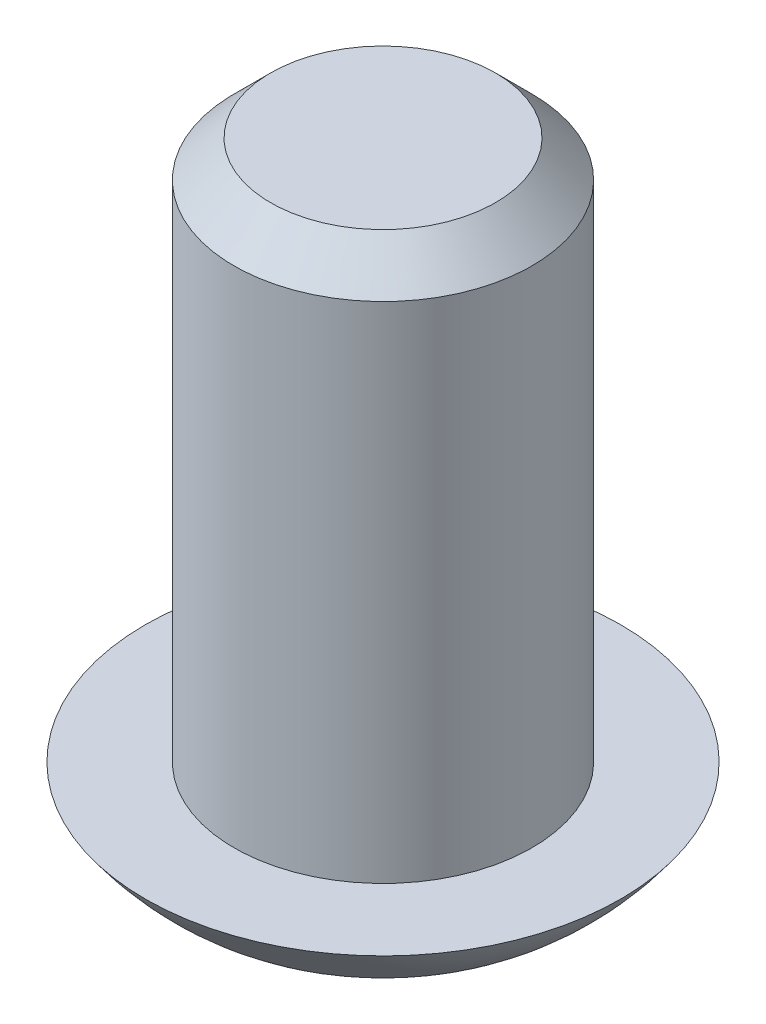
ISO-10303-21;
HEADER;
FILE_DESCRIPTION(('STEP AP214'),'2;1');
FILE_NAME('part.step','',(''),(''),'','','');
FILE_SCHEMA(('AUTOMOTIVE_DESIGN { 1 0 10303 214 1 1 1 1 }'));
ENDSEC;
DATA;
#1=APPLICATION_CONTEXT('core data for automotive mechanical design processes');
#2=APPLICATION_PROTOCOL_DEFINITION('international standard','automotive_design',2000,#1);
#3=PRODUCT_CONTEXT('',#1,'mechanical');
#4=PRODUCT('Part','Part','',(#3));
#5=PRODUCT_RELATED_PRODUCT_CATEGORY('part','',(#4));
#6=PRODUCT_DEFINITION_FORMATION('','',#4);
#7=PRODUCT_DEFINITION_CONTEXT('part definition',#1,'design');
#8=PRODUCT_DEFINITION('design','',#6,#7);
#9=PRODUCT_DEFINITION_SHAPE('','',#8);
#10=(LENGTH_UNIT() NAMED_UNIT(*) SI_UNIT(.MILLI.,.METRE.));
#11=(NAMED_UNIT(*) PLANE_ANGLE_UNIT() SI_UNIT($,.RADIAN.));
#12=(NAMED_UNIT(*) SI_UNIT($,.STERADIAN.) SOLID_ANGLE_UNIT());
#13=UNCERTAINTY_MEASURE_WITH_UNIT(LENGTH_MEASURE(1.E-05),#10,'distance_accuracy_value','');
#14=(GEOMETRIC_REPRESENTATION_CONTEXT(3) GLOBAL_UNCERTAINTY_ASSIGNED_CONTEXT((#13)) GLOBAL_UNIT_ASSIGNED_CONTEXT((#10,
#11,#12)) REPRESENTATION_CONTEXT('',''));
#15=CARTESIAN_POINT('',(0.,0.,0.));
#16=DIRECTION('',(0.,0.,1.));
#17=DIRECTION('',(1.,0.,0.));
#18=AXIS2_PLACEMENT_3D('',#15,#16,#17);
#19=CARTESIAN_POINT('',(0.,2.54,0.));
#20=DIRECTION('',(0.,-1.,0.));
#21=DIRECTION('',(0.,0.,-1.));
#22=AXIS2_PLACEMENT_3D('',#19,#20,#21);
#23=CYLINDRICAL_SURFACE('',#22,0.7);
#24=CARTESIAN_POINT('',(0.,0.,0.));
#25=DIRECTION('',(0.,-1.,0.));
#26=DIRECTION('',(0.,0.,-1.));
#27=AXIS2_PLACEMENT_3D('',#24,#25,#26);
#28=CIRCLE('',#27,0.699999999999999);
#29=CARTESIAN_POINT('',(0.,0.,-0.699999999999999));
#30=VERTEX_POINT('',#29);
#31=EDGE_CURVE('E258',#30,#30,#28,.T.);
#32=ORIENTED_EDGE('',*,*,#31,.F.);
#33=EDGE_LOOP('',(#32));
#34=FACE_BOUND('',#33,.T.);
#35=CARTESIAN_POINT('',(0.,2.36850000000001,0.));
#36=DIRECTION('',(0.,-1.,0.));
#37=DIRECTION('',(0.,0.,-1.));
#38=AXIS2_PLACEMENT_3D('',#35,#36,#37);
#39=CIRCLE('',#38,0.7);
#40=CARTESIAN_POINT('',(0.,2.36850000000001,-0.7));
#41=VERTEX_POINT('',#40);
#42=EDGE_CURVE('E140',#41,#41,#39,.T.);
#43=ORIENTED_EDGE('',*,*,#42,.T.);
#44=EDGE_LOOP('',(#43));
#45=FACE_BOUND('',#44,.T.);
#46=ADVANCED_FACE('F47',(#34,#45),#23,.T.);
#47=CARTESIAN_POINT('',(0.,2.54,0.));
#48=DIRECTION('',(0.,-1.,0.));
#49=DIRECTION('',(0.,0.,-1.));
#50=AXIS2_PLACEMENT_3D('',#47,#48,#49);
#51=CONICAL_SURFACE('',#50,0.528500000000001,0.785398163397461);
#52=ORIENTED_EDGE('',*,*,#42,.F.);
#53=EDGE_LOOP('',(#52));
#54=FACE_BOUND('',#53,.T.);
#55=CARTESIAN_POINT('',(0.,2.54,0.));
#56=DIRECTION('',(0.,-1.,0.));
#57=DIRECTION('',(0.,0.,-1.));
#58=AXIS2_PLACEMENT_3D('',#55,#56,#57);
#59=CIRCLE('',#58,0.528500000000001);
#60=CARTESIAN_POINT('',(0.,2.54,-0.528500000000001));
#61=VERTEX_POINT('',#60);
#62=EDGE_CURVE('E261',#61,#61,#59,.T.);
#63=ORIENTED_EDGE('',*,*,#62,.T.);
#64=EDGE_LOOP('',(#63));
#65=FACE_BOUND('',#64,.T.);
#66=ADVANCED_FACE('F161',(#54,#65),#51,.T.);
#67=CARTESIAN_POINT('',(0.,2.54,0.));
#68=DIRECTION('',(0.,1.,0.));
#69=DIRECTION('',(0.,0.,1.));
#70=AXIS2_PLACEMENT_3D('',#67,#68,#69);
#71=PLANE('',#70);
#72=ORIENTED_EDGE('',*,*,#62,.F.);
#73=EDGE_LOOP('',(#72));
#74=FACE_BOUND('',#73,.T.);
#75=ADVANCED_FACE('F49',(#74),#71,.T.);
#76=CARTESIAN_POINT('',(1.11694871713695,0.,0.));
#77=CARTESIAN_POINT('',(0.722805152040096,-0.559065825798239,0.));
#78=CARTESIAN_POINT('',(0.,-0.478908215937554,0.));
#79=B_SPLINE_CURVE_WITH_KNOTS('',2,(#76,#77,#78),.UNSPECIFIED.,.F.,.F.,(3,3),(0.,1.),.UNSPECIFIED.);
#80=CARTESIAN_POINT('',(0.,0.,0.));
#81=DIRECTION('',(0.,1.,0.));
#82=AXIS1_PLACEMENT('',#80,#81);
#83=SURFACE_OF_REVOLUTION('',#79,#82);
#84=CARTESIAN_POINT('',(-0.899315648743908,-0.238000032,-0.058524320668122));
#85=CARTESIAN_POINT('',(-0.870908297649099,-0.261900915256852,-0.0585243206681219));
#86=CARTESIAN_POINT('',(-0.841263504507934,-0.284330744241003,-0.0585243206681219));
#87=CARTESIAN_POINT('',(-0.779868665745607,-0.325856790653514,-0.058524320668122));
#88=CARTESIAN_POINT('',(-0.748125839960084,-0.344963695028522,-0.058524320668122));
#89=CARTESIAN_POINT('',(-0.663683025897662,-0.389694797470847,-0.0585243206681222));
#90=CARTESIAN_POINT('',(-0.609536626906563,-0.412641469070939,-0.0585243206681223));
#91=CARTESIAN_POINT('',(-0.498010574017839,-0.449312698549096,-0.0585243206681216));
#92=CARTESIAN_POINT('',(-0.440618720207825,-0.462999552814263,-0.0585243206681209));
#93=CARTESIAN_POINT('',(-0.355511650964227,-0.476778019573035,-0.0585243206681214));
#94=CARTESIAN_POINT('',(-0.328284207991363,-0.480227578762016,-0.0585243206681218));
#95=CARTESIAN_POINT('',(-0.273652683010128,-0.485402117770418,-0.0585243206681221));
#96=CARTESIAN_POINT('',(-0.246248543258705,-0.487126501725287,-0.058524320668122));
#97=CARTESIAN_POINT('',(-0.1915785286076,-0.489007186815417,-0.0585243206681219));
#98=CARTESIAN_POINT('',(-0.164312983513688,-0.489174089859625,-0.0585243206681219));
#99=CARTESIAN_POINT('',(-0.123450917767678,-0.488478308575888,-0.058524320668122));
#100=CARTESIAN_POINT('',(-0.109843161677998,-0.488089128882075,-0.058524320668122));
#101=CARTESIAN_POINT('',(-0.0826373710026249,-0.487119521610592,-0.058524320668122));
#102=CARTESIAN_POINT('',(-0.0690393348854089,-0.486539138909099,-0.058524320668122));
#103=CARTESIAN_POINT('',(-0.0554440932645397,-0.485924805268687,-0.058524320668122));
#104=B_SPLINE_CURVE_WITH_KNOTS('',3,(#84,#85,#86,#87,#88,#89,#90,#91,#92,#93,#94,#95,#96,#97,
#98,#99,#100,#101,#102,#103),.UNSPECIFIED.,.F.,.F.,(4,2,2,2,2,2,2,2,2,4),(0.,0.111317463769919,
0.222270015519336,0.397787243667058,0.574014899984797,0.656307474395722,0.738628462335729,
0.820388671926627,0.861227383915214,0.90205651770105),.UNSPECIFIED.);
#105=CARTESIAN_POINT('',(-0.899315648743908,-0.238000032,-0.058524320668122));
#106=VERTEX_POINT('',#105);
#107=CARTESIAN_POINT('',(-0.0554440932645484,-0.485924805268688,-0.058524320668122));
#108=VERTEX_POINT('',#107);
#109=EDGE_CURVE('E11',#106,#108,#104,.T.);
#110=ORIENTED_EDGE('',*,*,#109,.F.);
#111=CARTESIAN_POINT('',(0.,-0.238000032,0.));
#112=DIRECTION('',(0.,1.,0.));
#113=DIRECTION('',(-1.,0.,0.));
#114=AXIS2_PLACEMENT_3D('',#111,#112,#113);
#115=CIRCLE('',#114,0.901217916036594);
#116=CARTESIAN_POINT('',(-0.899315648743908,-0.238000032,0.0585243206681215));
#117=VERTEX_POINT('',#116);
#118=EDGE_CURVE('E215',#117,#106,#115,.F.);
#119=ORIENTED_EDGE('',*,*,#118,.F.);
#120=CARTESIAN_POINT('',(-0.899315648743908,-0.238000032,0.0585243206681214));
#121=CARTESIAN_POINT('',(-0.870908297649099,-0.261900915256853,0.0585243206681215));
#122=CARTESIAN_POINT('',(-0.841263504507934,-0.284330744241003,0.0585243206681215));
#123=CARTESIAN_POINT('',(-0.779868665745607,-0.325856790653515,0.0585243206681215));
#124=CARTESIAN_POINT('',(-0.748125839960084,-0.344963695028522,0.0585243206681216));
#125=CARTESIAN_POINT('',(-0.663683025897662,-0.389694797470847,0.0585243206681217));
#126=CARTESIAN_POINT('',(-0.609536626906563,-0.412641469070939,0.0585243206681218));
#127=CARTESIAN_POINT('',(-0.498010574017839,-0.449312698549096,0.0585243206681212));
#128=CARTESIAN_POINT('',(-0.440618720207825,-0.462999552814263,0.0585243206681204));
#129=CARTESIAN_POINT('',(-0.355511650964228,-0.476778019573035,0.058524320668121));
#130=CARTESIAN_POINT('',(-0.328284207991364,-0.480227578762016,0.0585243206681214));
#131=CARTESIAN_POINT('',(-0.273652683010131,-0.485402117770418,0.0585243206681217));
#132=CARTESIAN_POINT('',(-0.246248543258708,-0.487126501725287,0.0585243206681216));
#133=CARTESIAN_POINT('',(-0.191578528607605,-0.489007186815417,0.0585243206681215));
#134=CARTESIAN_POINT('',(-0.164312983513693,-0.489174089859625,0.0585243206681215));
#135=CARTESIAN_POINT('',(-0.123450917767684,-0.488478308575888,0.0585243206681215));
#136=CARTESIAN_POINT('',(-0.109843161678005,-0.488089128882075,0.0585243206681215));
#137=CARTESIAN_POINT('',(-0.0826373710026326,-0.487119521610592,0.0585243206681215));
#138=CARTESIAN_POINT('',(-0.069039334885417,-0.486539138909099,0.0585243206681215));
#139=CARTESIAN_POINT('',(-0.055444093264548,-0.485924805268687,0.0585243206681215));
#140=B_SPLINE_CURVE_WITH_KNOTS('',3,(#120,#121,#122,#123,#124,#125,#126,#127,#128,#129,#130,
#131,#132,#133,#134,#135,#136,#137,#138,#139),.UNSPECIFIED.,.F.,.F.,(4,2,2,2,2,2,2,2,2,4),(0.,
0.11131746376992,0.222270015519336,0.397787243667058,0.574014899984797,0.65630747439572,
0.738628462335725,0.82038867192662,0.861227383915207,0.902056517701042),.UNSPECIFIED.);
#141=CARTESIAN_POINT('',(-0.0554440932645484,-0.485924805268687,0.0585243206681215));
#142=VERTEX_POINT('',#141);
#143=EDGE_CURVE('E132',#117,#142,#140,.T.);
#144=ORIENTED_EDGE('',*,*,#143,.T.);
#145=CARTESIAN_POINT('',(-0.0554440932645485,-0.238000032,0.899510802996503));
#146=CARTESIAN_POINT('',(-0.0554440932645485,-0.261902810827655,0.871107346976378));
#147=CARTESIAN_POINT('',(-0.0554440932645484,-0.284334905605569,0.841466424604842));
#148=CARTESIAN_POINT('',(-0.0554440932645484,-0.32586788481248,0.780076237972695));
#149=CARTESIAN_POINT('',(-0.0554440932645484,-0.344979151549301,0.748333989435702));
#150=CARTESIAN_POINT('',(-0.0554440932645485,-0.389714635457796,0.663903536446075));
#151=CARTESIAN_POINT('',(-0.0554440932645486,-0.412662988634491,0.609769485309013));
#152=CARTESIAN_POINT('',(-0.0554440932645482,-0.449337139106365,0.49827165677898));
#153=CARTESIAN_POINT('',(-0.0554440932645477,-0.463026007849966,0.440895924473377));
#154=CARTESIAN_POINT('',(-0.055444093264548,-0.47676855613836,0.356036927922827));
#155=CARTESIAN_POINT('',(-0.0554440932645483,-0.480196985496946,0.329043854754958));
#156=CARTESIAN_POINT('',(-0.0554440932645485,-0.485354250683286,0.274883463225116));
#157=CARTESIAN_POINT('',(-0.0554440932645484,-0.48708255301048,0.24771609285869));
#158=CARTESIAN_POINT('',(-0.0554440932645484,-0.488988215510948,0.193513238710436));
#159=CARTESIAN_POINT('',(-0.0554440932645484,-0.489175844473608,0.166478084026633));
#160=CARTESIAN_POINT('',(-0.0554440932645484,-0.488505526627026,0.125959953640712));
#161=CARTESIAN_POINT('',(-0.0554440932645484,-0.488123865475893,0.112466048739799));
#162=CARTESIAN_POINT('',(-0.0554440932645484,-0.487152850011281,0.0854883490188783));
#163=CARTESIAN_POINT('',(-0.0554440932645484,-0.486563540521024,0.0720045526458262));
#164=CARTESIAN_POINT('',(-0.0554440932645484,-0.485924805268687,0.0585243206681217));
#165=B_SPLINE_CURVE_WITH_KNOTS('',3,(#145,#146,#147,#148,#149,#150,#151,#152,#153,#154,#155,
#156,#157,#158,#159,#160,#161,#162,#163,#164),.UNSPECIFIED.,.F.,.F.,(4,2,2,2,2,2,2,2,2,4),(0.,
0.111312285149621,0.222270042099696,0.397755510075376,0.573936784299827,0.655525020341214,
0.737138850645145,0.818208268867295,0.85870470340935,0.899192401692169),.UNSPECIFIED.);
#166=CARTESIAN_POINT('',(-0.0554440932645484,-0.238000032,0.899510802996503));
#167=VERTEX_POINT('',#166);
#168=EDGE_CURVE('E76',#167,#142,#165,.T.);
#169=ORIENTED_EDGE('',*,*,#168,.F.);
#170=CARTESIAN_POINT('',(0.0554440932645484,-0.238000032,0.899510802996503));
#171=VERTEX_POINT('',#170);
#172=EDGE_CURVE('E125',#171,#167,#115,.F.);
#173=ORIENTED_EDGE('',*,*,#172,.F.);
#174=CARTESIAN_POINT('',(0.0554440932645484,-0.238000032,0.899510802996503));
#175=CARTESIAN_POINT('',(0.0554440932645486,-0.261902810827655,0.871107346976378));
#176=CARTESIAN_POINT('',(0.0554440932645485,-0.284334905605569,0.841466424604842));
#177=CARTESIAN_POINT('',(0.0554440932645483,-0.32586788481248,0.780076237972695));
#178=CARTESIAN_POINT('',(0.0554440932645482,-0.3449791515493,0.748333989435702));
#179=CARTESIAN_POINT('',(0.0554440932645482,-0.389714635457796,0.663903536446075));
#180=CARTESIAN_POINT('',(0.0554440932645485,-0.412662988634491,0.609769485309013));
#181=CARTESIAN_POINT('',(0.0554440932645483,-0.449337139106365,0.49827165677898));
#182=CARTESIAN_POINT('',(0.0554440932645477,-0.463026007849966,0.440895924473377));
#183=CARTESIAN_POINT('',(0.055444093264548,-0.47676855613836,0.356036927922827));
#184=CARTESIAN_POINT('',(0.0554440932645483,-0.480196985496946,0.329043854754958));
#185=CARTESIAN_POINT('',(0.0554440932645485,-0.485354250683286,0.274883463225116));
#186=CARTESIAN_POINT('',(0.0554440932645484,-0.48708255301048,0.24771609285869));
#187=CARTESIAN_POINT('',(0.0554440932645484,-0.488988215510948,0.193513238710436));
#188=CARTESIAN_POINT('',(0.0554440932645484,-0.489175844473608,0.166478084026633));
#189=CARTESIAN_POINT('',(0.0554440932645484,-0.488505526627026,0.125959953640712));
#190=CARTESIAN_POINT('',(0.0554440932645484,-0.488123865475893,0.112466048739798));
#191=CARTESIAN_POINT('',(0.0554440932645484,-0.487152850011281,0.0854883490188781));
#192=CARTESIAN_POINT('',(0.0554440932645484,-0.486563540521024,0.0720045526458259));
#193=CARTESIAN_POINT('',(0.0554440932645484,-0.485924805268687,0.0585243206681214));
#194=B_SPLINE_CURVE_WITH_KNOTS('',3,(#174,#175,#176,#177,#178,#179,#180,#181,#182,#183,#184,
#185,#186,#187,#188,#189,#190,#191,#192,#193),.UNSPECIFIED.,.F.,.F.,(4,2,2,2,2,2,2,2,2,4),(0.,
0.111312285149621,0.222270042099696,0.397755510075376,0.573936784299827,0.655525020341214,
0.737138850645145,0.818208268867296,0.85870470340935,0.899192401692169),.UNSPECIFIED.);
#195=CARTESIAN_POINT('',(0.0554440932645484,-0.485924805268687,0.0585243206681215));
#196=VERTEX_POINT('',#195);
#197=EDGE_CURVE('E183',#171,#196,#194,.T.);
#198=ORIENTED_EDGE('',*,*,#197,.T.);
#199=CARTESIAN_POINT('',(0.0554440932645484,-0.485924805268687,0.0585243206681215));
#200=CARTESIAN_POINT('',(0.060753847938319,-0.486158392360907,0.0585243206681215));
#201=CARTESIAN_POINT('',(0.0660637787954903,-0.486389161084399,0.0585243206681215));
#202=CARTESIAN_POINT('',(0.0926160864581981,-0.487507320685653,0.0585243206681216));
#203=CARTESIAN_POINT('',(0.11386303619206,-0.488287504694678,0.0585243206681215));
#204=CARTESIAN_POINT('',(0.17785132929435,-0.4894577049361,0.0585243206681214));
#205=CARTESIAN_POINT('',(0.220632524162728,-0.488658201537733,0.0585243206681215));
#206=CARTESIAN_POINT('',(0.305922952760618,-0.483026629121184,0.0585243206681216));
#207=CARTESIAN_POINT('',(0.348432227734793,-0.47819518701737,0.0585243206681217));
#208=CARTESIAN_POINT('',(0.451194294623467,-0.460831841643674,0.0585243206681217));
#209=CARTESIAN_POINT('',(0.511079353285725,-0.445856830643054,0.0585243206681215));
#210=CARTESIAN_POINT('',(0.598200994470147,-0.415756552517803,0.0585243206681215));
#211=CARTESIAN_POINT('',(0.626798615423211,-0.404445685856411,0.0585243206681215));
#212=CARTESIAN_POINT('',(0.682865029389634,-0.379309706344783,0.0585243206681215));
#213=CARTESIAN_POINT('',(0.710334199160012,-0.365485441147775,0.0585243206681214));
#214=CARTESIAN_POINT('',(0.765863810182244,-0.334323605973629,0.0585243206681214));
#215=CARTESIAN_POINT('',(0.793821664387465,-0.316803512056508,0.0585243206681215));
#216=CARTESIAN_POINT('',(0.847950216106335,-0.279237137956431,0.0585243206681215));
#217=CARTESIAN_POINT('',(0.874122473721009,-0.259193107707113,0.0585243206681215));
#218=CARTESIAN_POINT('',(0.899315648743908,-0.238000032,0.0585243206681213));
#219=B_SPLINE_CURVE_WITH_KNOTS('',3,(#199,#200,#201,#202,#203,#204,#205,#206,#207,#208,#209,
#210,#211,#212,#213,#214,#215,#216,#217,#218),.UNSPECIFIED.,.F.,.F.,(4,2,2,2,2,2,2,2,2,4),(0.,
0.0159447704269467,0.0797272428461828,0.207916531252977,0.336085891594823,0.520289661205665,
0.612446126160565,0.704571568455895,0.803405078242753,0.90215109963364),.UNSPECIFIED.);
#220=CARTESIAN_POINT('',(0.899315648743908,-0.238000032,0.0585243206681215));
#221=VERTEX_POINT('',#220);
#222=EDGE_CURVE('E175',#196,#221,#219,.T.);
#223=ORIENTED_EDGE('',*,*,#222,.T.);
#224=CARTESIAN_POINT('',(0.899315648743908,-0.238000032,-0.058524320668122));
#225=VERTEX_POINT('',#224);
#226=EDGE_CURVE('E265',#225,#221,#115,.F.);
#227=ORIENTED_EDGE('',*,*,#226,.F.);
#228=CARTESIAN_POINT('',(0.0554440932645484,-0.485924805268687,-0.0585243206681219));
#229=CARTESIAN_POINT('',(0.060753847938319,-0.486158392360907,-0.0585243206681219));
#230=CARTESIAN_POINT('',(0.0660637787954903,-0.486389161084399,-0.058524320668122));
#231=CARTESIAN_POINT('',(0.0926160864581982,-0.487507320685653,-0.058524320668122));
#232=CARTESIAN_POINT('',(0.11386303619206,-0.488287504694678,-0.058524320668122));
#233=CARTESIAN_POINT('',(0.177851329294351,-0.4894577049361,-0.0585243206681219));
#234=CARTESIAN_POINT('',(0.220632524162729,-0.488658201537733,-0.0585243206681219));
#235=CARTESIAN_POINT('',(0.305922952760619,-0.483026629121184,-0.058524320668122));
#236=CARTESIAN_POINT('',(0.348432227734795,-0.478195187017369,-0.058524320668122));
#237=CARTESIAN_POINT('',(0.451194294623468,-0.460831841643674,-0.0585243206681219));
#238=CARTESIAN_POINT('',(0.511079353285726,-0.445856830643053,-0.058524320668122));
#239=CARTESIAN_POINT('',(0.598200994470148,-0.415756552517803,-0.058524320668122));
#240=CARTESIAN_POINT('',(0.626798615423212,-0.40444568585641,-0.058524320668122));
#241=CARTESIAN_POINT('',(0.682865029389635,-0.379309706344783,-0.058524320668122));
#242=CARTESIAN_POINT('',(0.710334199160013,-0.365485441147774,-0.058524320668122));
#243=CARTESIAN_POINT('',(0.765863810182245,-0.334323605973628,-0.058524320668122));
#244=CARTESIAN_POINT('',(0.793821664387465,-0.316803512056507,-0.058524320668122));
#245=CARTESIAN_POINT('',(0.847950216106336,-0.279237137956431,-0.0585243206681219));
#246=CARTESIAN_POINT('',(0.874122473721009,-0.259193107707113,-0.0585243206681219));
#247=CARTESIAN_POINT('',(0.899315648743908,-0.238000032,-0.0585243206681219));
#248=B_SPLINE_CURVE_WITH_KNOTS('',3,(#228,#229,#230,#231,#232,#233,#234,#235,#236,#237,#238,
#239,#240,#241,#242,#243,#244,#245,#246,#247),.UNSPECIFIED.,.F.,.F.,(4,2,2,2,2,2,2,2,2,4),(0.,
0.0159447704269468,0.0797272428461831,0.207916531252978,0.336085891594825,0.520289661205666,
0.612446126160566,0.704571568455897,0.803405078242754,0.90215109963364),.UNSPECIFIED.);
#249=CARTESIAN_POINT('',(0.0554440932645484,-0.485924805268687,-0.058524320668122));
#250=VERTEX_POINT('',#249);
#251=EDGE_CURVE('E165',#250,#225,#248,.T.);
#252=ORIENTED_EDGE('',*,*,#251,.F.);
#253=CARTESIAN_POINT('',(0.0554440932645484,-0.485924805268687,-0.0585243206681219));
#254=CARTESIAN_POINT('',(0.0554440932645486,-0.486170744032485,-0.0638334982015836));
#255=CARTESIAN_POINT('',(0.0554440932645485,-0.486411072382658,-0.0691430142046148));
#256=CARTESIAN_POINT('',(0.0554440932645479,-0.487565308276258,-0.0956941609969826));
#257=CARTESIAN_POINT('',(0.0554440932645458,-0.488336791875073,-0.116942214996004));
#258=CARTESIAN_POINT('',(0.0554440932645536,-0.48945310539865,-0.18091506948727));
#259=CARTESIAN_POINT('',(0.055444093264578,-0.488582049091718,-0.223678100004071));
#260=CARTESIAN_POINT('',(0.0554440932645188,-0.482782737599824,-0.308970873743231));
#261=CARTESIAN_POINT('',(0.0554440932644352,-0.477851090626515,-0.351500392007));
#262=CARTESIAN_POINT('',(0.0554440932643945,-0.460266815409747,-0.454108948393237));
#263=CARTESIAN_POINT('',(0.0554440932645079,-0.445194057497692,-0.513804299082633));
#264=CARTESIAN_POINT('',(0.0554440932645889,-0.404814070709817,-0.62966127429317));
#265=CARTESIAN_POINT('',(0.0554440932645567,-0.379512922846935,-0.685824975575463));
#266=CARTESIAN_POINT('',(0.0554440932645438,-0.333396684225688,-0.76761340099718));
#267=CARTESIAN_POINT('',(0.0554440932645461,-0.316022006999829,-0.795231084718533));
#268=CARTESIAN_POINT('',(0.0554440932645507,-0.27880480941349,-0.848714523136099));
#269=CARTESIAN_POINT('',(0.0554440932645529,-0.258964576972146,-0.874581868135063));
#270=CARTESIAN_POINT('',(0.0554440932645484,-0.238000032,-0.899510802996503));
#271=B_SPLINE_CURVE_WITH_KNOTS('',3,(#253,#254,#255,#256,#257,#258,#259,#260,#261,#262,#263,
#264,#265,#266,#267,#268,#269,#270),.UNSPECIFIED.,.F.,.F.,(4,2,2,2,2,2,2,2,4),(0.,
0.0159447713641637,0.0797281388745831,0.207867634085989,0.336114272204353,0.519950262648427,
0.703677118725809,0.801435795253943,0.899104424399363),.UNSPECIFIED.);
#272=CARTESIAN_POINT('',(0.0554440932645484,-0.238000032,-0.899510802996503));
#273=VERTEX_POINT('',#272);
#274=EDGE_CURVE('E191',#250,#273,#271,.T.);
#275=ORIENTED_EDGE('',*,*,#274,.T.);
#276=CARTESIAN_POINT('',(-0.0554440932645484,-0.238000032,-0.899510802996503));
#277=VERTEX_POINT('',#276);
#278=EDGE_CURVE('E269',#277,#273,#115,.F.);
#279=ORIENTED_EDGE('',*,*,#278,.F.);
#280=CARTESIAN_POINT('',(-0.05544409326454,-0.485924805268688,-0.0585243206681283));
#281=CARTESIAN_POINT('',(-0.0554440932645439,-0.486170744032486,-0.0638334982015899));
#282=CARTESIAN_POINT('',(-0.0554440932645466,-0.486411072382658,-0.0691430142046209));
#283=CARTESIAN_POINT('',(-0.0554440932645556,-0.487565308276258,-0.095694160996988));
#284=CARTESIAN_POINT('',(-0.0554440932645485,-0.488336791875072,-0.116942214996009));
#285=CARTESIAN_POINT('',(-0.0554440932645482,-0.489453105398651,-0.180915069487273));
#286=CARTESIAN_POINT('',(-0.0554440932645765,-0.488582049091718,-0.223678100004073));
#287=CARTESIAN_POINT('',(-0.0554440932645203,-0.482782737599824,-0.308970873743231));
#288=CARTESIAN_POINT('',(-0.0554440932644356,-0.477851090626515,-0.351500392006998));
#289=CARTESIAN_POINT('',(-0.0554440932643937,-0.460266815409748,-0.454108948393235));
#290=CARTESIAN_POINT('',(-0.0554440932645076,-0.445194057497692,-0.513804299082631));
#291=CARTESIAN_POINT('',(-0.0554440932645892,-0.404814070709817,-0.629661274293169));
#292=CARTESIAN_POINT('',(-0.0554440932645569,-0.379512922846935,-0.685824975575462));
#293=CARTESIAN_POINT('',(-0.0554440932645439,-0.333396684225688,-0.767613400997179));
#294=CARTESIAN_POINT('',(-0.0554440932645462,-0.316022006999829,-0.795231084718532));
#295=CARTESIAN_POINT('',(-0.0554440932645506,-0.27880480941349,-0.848714523136099));
#296=CARTESIAN_POINT('',(-0.0554440932645529,-0.258964576972147,-0.874581868135063));
#297=CARTESIAN_POINT('',(-0.0554440932645483,-0.238000032,-0.899510802996503));
#298=B_SPLINE_CURVE_WITH_KNOTS('',3,(#280,#281,#282,#283,#284,#285,#286,#287,#288,#289,#290,
#291,#292,#293,#294,#295,#296,#297),.UNSPECIFIED.,.F.,.F.,(4,2,2,2,2,2,2,2,4),(0.,
0.0159447713641632,0.0797281388745809,0.207867634085983,0.336114272204344,0.519950262648419,
0.703677118725802,0.801435795253936,0.899104424399356),.UNSPECIFIED.);
#299=EDGE_CURVE('E61',#108,#277,#298,.T.);
#300=ORIENTED_EDGE('',*,*,#299,.F.);
#301=EDGE_LOOP('',(#110,#119,#144,#169,#173,#198,#223,#227,#252,#275,#279,#300));
#302=FACE_BOUND('',#301,.T.);
#303=CARTESIAN_POINT('',(0.,0.,0.));
#304=DIRECTION('',(0.,1.,0.));
#305=DIRECTION('',(-1.,0.,0.));
#306=AXIS2_PLACEMENT_3D('',#303,#304,#305);
#307=CIRCLE('',#306,1.11694871713695);
#308=CARTESIAN_POINT('',(-1.11694871713695,0.,0.));
#309=VERTEX_POINT('',#308);
#310=EDGE_CURVE('E136',#309,#309,#307,.T.);
#311=ORIENTED_EDGE('',*,*,#310,.F.);
#312=EDGE_LOOP('',(#311));
#313=FACE_BOUND('',#312,.T.);
#314=ADVANCED_FACE('F154',(#302,#313),#83,.F.);
#315=CARTESIAN_POINT('',(0.,0.,0.));
#316=DIRECTION('',(0.,1.,0.));
#317=DIRECTION('',(-1.,0.,0.));
#318=AXIS2_PLACEMENT_3D('',#315,#316,#317);
#319=PLANE('',#318);
#320=ORIENTED_EDGE('',*,*,#31,.T.);
#321=EDGE_LOOP('',(#320));
#322=FACE_BOUND('',#321,.T.);
#323=ORIENTED_EDGE('',*,*,#310,.T.);
#324=EDGE_LOOP('',(#323));
#325=FACE_BOUND('',#324,.T.);
#326=ADVANCED_FACE('F159',(#322,#325),#319,.T.);
#327=CARTESIAN_POINT('',(0.,-0.238000032,-0.058524320668122));
#328=DIRECTION('',(0.,0.,-1.));
#329=DIRECTION('',(-1.,0.,0.));
#330=AXIS2_PLACEMENT_3D('',#327,#328,#329);
#331=PLANE('',#330);
#332=ORIENTED_EDGE('',*,*,#109,.T.);
#333=DIRECTION('',(0.,-1.,0.));
#334=VECTOR('',#333,1.);
#335=CARTESIAN_POINT('',(-0.0554440932645484,-0.238000032,-0.058524320668122));
#336=LINE('',#335,#334);
#337=CARTESIAN_POINT('',(-0.0554440932645484,-0.238000032,-0.058524320668122));
#338=VERTEX_POINT('',#337);
#339=EDGE_CURVE('E281',#338,#108,#336,.T.);
#340=ORIENTED_EDGE('',*,*,#339,.F.);
#341=DIRECTION('',(1.,0.,0.));
#342=VECTOR('',#341,1.);
#343=CARTESIAN_POINT('',(0.,-0.238000032,-0.058524320668122));
#344=LINE('',#343,#342);
#345=EDGE_CURVE('E133',#106,#338,#344,.T.);
#346=ORIENTED_EDGE('',*,*,#345,.F.);
#347=EDGE_LOOP('',(#332,#340,#346));
#348=FACE_BOUND('',#347,.T.);
#349=ADVANCED_FACE('F241',(#348),#331,.F.);
#350=CARTESIAN_POINT('',(0.,-0.238000032,0.0585243206681215));
#351=DIRECTION('',(0.,0.,-1.));
#352=DIRECTION('',(-1.,0.,0.));
#353=AXIS2_PLACEMENT_3D('',#350,#351,#352);
#354=PLANE('',#353);
#355=DIRECTION('',(1.,0.,0.));
#356=VECTOR('',#355,1.);
#357=CARTESIAN_POINT('',(0.,-0.238000032,0.0585243206681215));
#358=LINE('',#357,#356);
#359=CARTESIAN_POINT('',(-0.0554440932645484,-0.238000032,0.0585243206681215));
#360=VERTEX_POINT('',#359);
#361=EDGE_CURVE('E121',#117,#360,#358,.T.);
#362=ORIENTED_EDGE('',*,*,#361,.T.);
#363=DIRECTION('',(0.,-1.,0.));
#364=VECTOR('',#363,1.);
#365=CARTESIAN_POINT('',(-0.0554440932645484,-0.238000032,0.0585243206681215));
#366=LINE('',#365,#364);
#367=EDGE_CURVE('E130',#360,#142,#366,.T.);
#368=ORIENTED_EDGE('',*,*,#367,.T.);
#369=ORIENTED_EDGE('',*,*,#143,.F.);
#370=EDGE_LOOP('',(#362,#368,#369));
#371=FACE_BOUND('',#370,.T.);
#372=ADVANCED_FACE('F129',(#371),#354,.T.);
#373=CARTESIAN_POINT('',(-0.0554440932645484,-0.238000032,0.));
#374=DIRECTION('',(-1.,0.,0.));
#375=DIRECTION('',(0.,0.,1.));
#376=AXIS2_PLACEMENT_3D('',#373,#374,#375);
#377=PLANE('',#376);
#378=ORIENTED_EDGE('',*,*,#168,.T.);
#379=ORIENTED_EDGE('',*,*,#367,.F.);
#380=DIRECTION('',(0.,0.,-1.));
#381=VECTOR('',#380,1.);
#382=CARTESIAN_POINT('',(-0.0554440932645484,-0.238000032,0.));
#383=LINE('',#382,#381);
#384=EDGE_CURVE('E118',#167,#360,#383,.T.);
#385=ORIENTED_EDGE('',*,*,#384,.F.);
#386=EDGE_LOOP('',(#378,#379,#385));
#387=FACE_BOUND('',#386,.T.);
#388=ADVANCED_FACE('F135',(#387),#377,.F.);
#389=CARTESIAN_POINT('',(0.0554440932645484,-0.238000032,0.));
#390=DIRECTION('',(-1.,0.,0.));
#391=DIRECTION('',(0.,0.,1.));
#392=AXIS2_PLACEMENT_3D('',#389,#390,#391);
#393=PLANE('',#392);
#394=DIRECTION('',(0.,0.,-1.));
#395=VECTOR('',#394,1.);
#396=CARTESIAN_POINT('',(0.0554440932645484,-0.238000032,0.));
#397=LINE('',#396,#395);
#398=CARTESIAN_POINT('',(0.0554440932645484,-0.238000032,0.0585243206681215));
#399=VERTEX_POINT('',#398);
#400=EDGE_CURVE('E126',#171,#399,#397,.T.);
#401=ORIENTED_EDGE('',*,*,#400,.T.);
#402=DIRECTION('',(0.,-1.,0.));
#403=VECTOR('',#402,1.);
#404=CARTESIAN_POINT('',(0.0554440932645484,-0.238000032,0.0585243206681215));
#405=LINE('',#404,#403);
#406=EDGE_CURVE('E137',#399,#196,#405,.T.);
#407=ORIENTED_EDGE('',*,*,#406,.T.);
#408=ORIENTED_EDGE('',*,*,#197,.F.);
#409=EDGE_LOOP('',(#401,#407,#408));
#410=FACE_BOUND('',#409,.T.);
#411=ADVANCED_FACE('F232',(#410),#393,.T.);
#412=CARTESIAN_POINT('',(0.,-0.238000032,0.0585243206681215));
#413=DIRECTION('',(0.,0.,-1.));
#414=DIRECTION('',(-1.,0.,0.));
#415=AXIS2_PLACEMENT_3D('',#412,#413,#414);
#416=PLANE('',#415);
#417=ORIENTED_EDGE('',*,*,#406,.F.);
#418=DIRECTION('',(1.,0.,0.));
#419=VECTOR('',#418,1.);
#420=CARTESIAN_POINT('',(0.,-0.238000032,0.0585243206681215));
#421=LINE('',#420,#419);
#422=EDGE_CURVE('E286',#399,#221,#421,.T.);
#423=ORIENTED_EDGE('',*,*,#422,.T.);
#424=ORIENTED_EDGE('',*,*,#222,.F.);
#425=EDGE_LOOP('',(#417,#423,#424));
#426=FACE_BOUND('',#425,.T.);
#427=ADVANCED_FACE('F228',(#426),#416,.T.);
#428=CARTESIAN_POINT('',(0.,-0.238000032,-0.058524320668122));
#429=DIRECTION('',(0.,0.,-1.));
#430=DIRECTION('',(-1.,0.,0.));
#431=AXIS2_PLACEMENT_3D('',#428,#429,#430);
#432=PLANE('',#431);
#433=ORIENTED_EDGE('',*,*,#251,.T.);
#434=DIRECTION('',(1.,0.,0.));
#435=VECTOR('',#434,1.);
#436=CARTESIAN_POINT('',(0.,-0.238000032,-0.058524320668122));
#437=LINE('',#436,#435);
#438=CARTESIAN_POINT('',(0.0554440932645484,-0.238000032,-0.058524320668122));
#439=VERTEX_POINT('',#438);
#440=EDGE_CURVE('E68',#439,#225,#437,.T.);
#441=ORIENTED_EDGE('',*,*,#440,.F.);
#442=DIRECTION('',(0.,-1.,0.));
#443=VECTOR('',#442,1.);
#444=CARTESIAN_POINT('',(0.0554440932645484,-0.238000032,-0.058524320668122));
#445=LINE('',#444,#443);
#446=EDGE_CURVE('E143',#439,#250,#445,.T.);
#447=ORIENTED_EDGE('',*,*,#446,.T.);
#448=EDGE_LOOP('',(#433,#441,#447));
#449=FACE_BOUND('',#448,.T.);
#450=ADVANCED_FACE('F224',(#449),#432,.F.);
#451=CARTESIAN_POINT('',(0.0554440932645484,-0.238000032,0.));
#452=DIRECTION('',(-1.,0.,0.));
#453=DIRECTION('',(0.,0.,1.));
#454=AXIS2_PLACEMENT_3D('',#451,#452,#453);
#455=PLANE('',#454);
#456=ORIENTED_EDGE('',*,*,#446,.F.);
#457=DIRECTION('',(0.,0.,-1.));
#458=VECTOR('',#457,1.);
#459=CARTESIAN_POINT('',(0.0554440932645484,-0.238000032,0.));
#460=LINE('',#459,#458);
#461=EDGE_CURVE('E289',#439,#273,#460,.T.);
#462=ORIENTED_EDGE('',*,*,#461,.T.);
#463=ORIENTED_EDGE('',*,*,#274,.F.);
#464=EDGE_LOOP('',(#456,#462,#463));
#465=FACE_BOUND('',#464,.T.);
#466=ADVANCED_FACE('F220',(#465),#455,.T.);
#467=CARTESIAN_POINT('',(-0.0554440932645484,-0.238000032,0.));
#468=DIRECTION('',(-1.,0.,0.));
#469=DIRECTION('',(0.,0.,1.));
#470=AXIS2_PLACEMENT_3D('',#467,#468,#469);
#471=PLANE('',#470);
#472=ORIENTED_EDGE('',*,*,#299,.T.);
#473=DIRECTION('',(0.,0.,-1.));
#474=VECTOR('',#473,1.);
#475=CARTESIAN_POINT('',(-0.0554440932645484,-0.238000032,0.));
#476=LINE('',#475,#474);
#477=EDGE_CURVE('E291',#338,#277,#476,.T.);
#478=ORIENTED_EDGE('',*,*,#477,.F.);
#479=ORIENTED_EDGE('',*,*,#339,.T.);
#480=EDGE_LOOP('',(#472,#478,#479));
#481=FACE_BOUND('',#480,.T.);
#482=ADVANCED_FACE('F216',(#481),#471,.F.);
#483=CARTESIAN_POINT('',(0.,-0.238000032,0.));
#484=DIRECTION('',(0.,1.,0.));
#485=DIRECTION('',(0.,0.,1.));
#486=AXIS2_PLACEMENT_3D('',#483,#484,#485);
#487=PLANE('',#486);
#488=ORIENTED_EDGE('',*,*,#172,.T.);
#489=ORIENTED_EDGE('',*,*,#384,.T.);
#490=ORIENTED_EDGE('',*,*,#361,.F.);
#491=ORIENTED_EDGE('',*,*,#118,.T.);
#492=ORIENTED_EDGE('',*,*,#345,.T.);
#493=ORIENTED_EDGE('',*,*,#477,.T.);
#494=ORIENTED_EDGE('',*,*,#278,.T.);
#495=ORIENTED_EDGE('',*,*,#461,.F.);
#496=ORIENTED_EDGE('',*,*,#440,.T.);
#497=ORIENTED_EDGE('',*,*,#226,.T.);
#498=ORIENTED_EDGE('',*,*,#422,.F.);
#499=ORIENTED_EDGE('',*,*,#400,.F.);
#500=EDGE_LOOP('',(#488,#489,#490,#491,#492,#493,#494,#495,#496,#497,#498,#499));
#501=FACE_BOUND('',#500,.T.);
#502=ADVANCED_FACE('F120',(#501),#487,.F.);
#503=CLOSED_SHELL('',(#46,#66,#75,#314,#326,#349,#372,#388,#411,#427,#450,#466,#482,#502));
#504=MANIFOLD_SOLID_BREP('B2',#503);
#505=ADVANCED_BREP_SHAPE_REPRESENTATION('',(#18,#504),#14);
#506=SHAPE_DEFINITION_REPRESENTATION(#9,#505);
ENDSEC;
END-ISO-10303-21;
